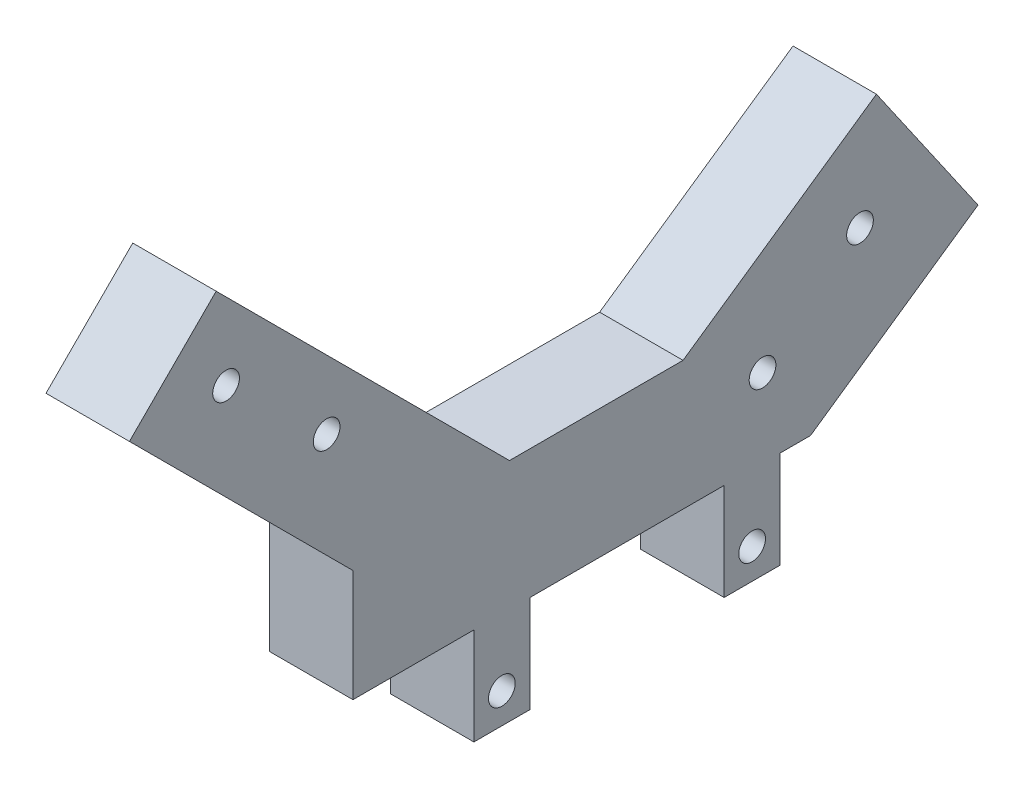
ISO-10303-21;
HEADER;
FILE_DESCRIPTION(('STEP AP214'),'2;1');
FILE_NAME('part.step','',(''),(''),'','','');
FILE_SCHEMA(('AUTOMOTIVE_DESIGN { 1 0 10303 214 1 1 1 1 }'));
ENDSEC;
DATA;
#1=APPLICATION_CONTEXT('core data for automotive mechanical design processes');
#2=APPLICATION_PROTOCOL_DEFINITION('international standard','automotive_design',2000,#1);
#3=PRODUCT_CONTEXT('',#1,'mechanical');
#4=PRODUCT('Part','Part','',(#3));
#5=PRODUCT_RELATED_PRODUCT_CATEGORY('part','',(#4));
#6=PRODUCT_DEFINITION_FORMATION('','',#4);
#7=PRODUCT_DEFINITION_CONTEXT('part definition',#1,'design');
#8=PRODUCT_DEFINITION('design','',#6,#7);
#9=PRODUCT_DEFINITION_SHAPE('','',#8);
#10=(LENGTH_UNIT() NAMED_UNIT(*) SI_UNIT(.MILLI.,.METRE.));
#11=(NAMED_UNIT(*) PLANE_ANGLE_UNIT() SI_UNIT($,.RADIAN.));
#12=(NAMED_UNIT(*) SI_UNIT($,.STERADIAN.) SOLID_ANGLE_UNIT());
#13=UNCERTAINTY_MEASURE_WITH_UNIT(LENGTH_MEASURE(1.E-05),#10,'distance_accuracy_value','');
#14=(GEOMETRIC_REPRESENTATION_CONTEXT(3) GLOBAL_UNCERTAINTY_ASSIGNED_CONTEXT((#13)) GLOBAL_UNIT_ASSIGNED_CONTEXT((#10,
#11,#12)) REPRESENTATION_CONTEXT('',''));
#15=CARTESIAN_POINT('',(0.,0.,0.));
#16=DIRECTION('',(0.,0.,1.));
#17=DIRECTION('',(1.,0.,0.));
#18=AXIS2_PLACEMENT_3D('',#15,#16,#17);
#19=CARTESIAN_POINT('',(10.,0.,0.));
#20=DIRECTION('',(1.,0.,0.));
#21=DIRECTION('',(0.,0.,-1.));
#22=AXIS2_PLACEMENT_3D('',#19,#20,#21);
#23=PLANE('',#22);
#24=CARTESIAN_POINT('',(10.,5.41185763148744,-16.2492077736495));
#25=DIRECTION('',(1.,0.,0.));
#26=DIRECTION('',(0.,0.,-1.));
#27=AXIS2_PLACEMENT_3D('',#24,#25,#26);
#28=CIRCLE('',#27,1.60000000000001);
#29=CARTESIAN_POINT('',(10.,5.41185763148744,-17.8492077736496));
#30=VERTEX_POINT('',#29);
#31=EDGE_CURVE('E366',#30,#30,#28,.T.);
#32=ORIENTED_EDGE('',*,*,#31,.F.);
#33=EDGE_LOOP('',(#32));
#34=FACE_BOUND('',#33,.T.);
#35=CARTESIAN_POINT('',(10.,36.2116014360766,48.0605143808522));
#36=DIRECTION('',(1.,0.,0.));
#37=DIRECTION('',(0.,0.,-1.));
#38=AXIS2_PLACEMENT_3D('',#35,#36,#37);
#39=CIRCLE('',#38,1.60000000000001);
#40=CARTESIAN_POINT('',(10.,36.2116014360766,46.4605143808522));
#41=VERTEX_POINT('',#40);
#42=EDGE_CURVE('E378',#41,#41,#39,.T.);
#43=ORIENTED_EDGE('',*,*,#42,.F.);
#44=EDGE_LOOP('',(#43));
#45=FACE_BOUND('',#44,.T.);
#46=CARTESIAN_POINT('',(10.,-12.,15.));
#47=DIRECTION('',(1.,0.,0.));
#48=DIRECTION('',(0.,0.,-1.));
#49=AXIS2_PLACEMENT_3D('',#46,#47,#48);
#50=CIRCLE('',#49,1.6);
#51=CARTESIAN_POINT('',(10.,-12.,13.4));
#52=VERTEX_POINT('',#51);
#53=EDGE_CURVE('E190',#52,#52,#50,.T.);
#54=ORIENTED_EDGE('',*,*,#53,.F.);
#55=EDGE_LOOP('',(#54));
#56=FACE_BOUND('',#55,.T.);
#57=DIRECTION('',(0.,0.568973278929439,-0.822356010414153));
#58=VECTOR('',#57,1.);
#59=CARTESIAN_POINT('',(10.,9.89128378958278,-42.078824948909));
#60=LINE('',#59,#58);
#61=CARTESIAN_POINT('',(10.,-4.00000000000002,-22.0012903092747));
#62=VERTEX_POINT('',#61);
#63=CARTESIAN_POINT('',(10.,9.89128378958278,-42.078824948909));
#64=VERTEX_POINT('',#63);
#65=EDGE_CURVE('E219',#62,#64,#60,.T.);
#66=ORIENTED_EDGE('',*,*,#65,.T.);
#67=DIRECTION('',(0.,0.822356010414153,0.568973278929439));
#68=VECTOR('',#67,1.);
#69=CARTESIAN_POINT('',(10.,27.4894583263576,-29.9029656585772));
#70=LINE('',#69,#68);
#71=CARTESIAN_POINT('',(10.,27.4894583263576,-29.9029656585772));
#72=VERTEX_POINT('',#71);
#73=EDGE_CURVE('E122',#64,#72,#70,.T.);
#74=ORIENTED_EDGE('',*,*,#73,.T.);
#75=DIRECTION('',(0.,-0.568973278929439,0.822356010414153));
#76=VECTOR('',#75,1.);
#77=CARTESIAN_POINT('',(10.,11.4487113078294,-6.71874029910208));
#78=LINE('',#77,#76);
#79=CARTESIAN_POINT('',(10.,11.4487113078294,-6.71874029910208));
#80=VERTEX_POINT('',#79);
#81=EDGE_CURVE('E261',#72,#80,#78,.T.);
#82=ORIENTED_EDGE('',*,*,#81,.T.);
#83=DIRECTION('',(0.,0.,1.));
#84=VECTOR('',#83,1.);
#85=CARTESIAN_POINT('',(10.,11.4487113078294,-6.71874029910208));
#86=LINE('',#85,#84);
#87=CARTESIAN_POINT('',(10.,11.4487113078294,14.0864897849331));
#88=VERTEX_POINT('',#87);
#89=EDGE_CURVE('E280',#80,#88,#86,.T.);
#90=ORIENTED_EDGE('',*,*,#89,.T.);
#91=DIRECTION('',(0.,0.707106781186548,0.707106781186548));
#92=VECTOR('',#91,1.);
#93=CARTESIAN_POINT('',(10.,11.4487113078294,14.0864897849331));
#94=LINE('',#93,#92);
#95=CARTESIAN_POINT('',(10.,46.6102733867151,49.2480518638188));
#96=VERTEX_POINT('',#95);
#97=EDGE_CURVE('E277',#88,#96,#94,.T.);
#98=ORIENTED_EDGE('',*,*,#97,.T.);
#99=DIRECTION('',(0.,-0.707106781186548,0.707106781186548));
#100=VECTOR('',#99,1.);
#101=CARTESIAN_POINT('',(10.,46.6102733867151,49.2480518638188));
#102=LINE('',#101,#100);
#103=CARTESIAN_POINT('',(10.,36.2116014360766,59.6467238144573));
#104=VERTEX_POINT('',#103);
#105=EDGE_CURVE('E279',#96,#104,#102,.T.);
#106=ORIENTED_EDGE('',*,*,#105,.T.);
#107=DIRECTION('',(0.,-0.707106781186547,-0.707106781186548));
#108=VECTOR('',#107,1.);
#109=CARTESIAN_POINT('',(10.,36.2116014360766,59.6467238144573));
#110=LINE('',#109,#108);
#111=CARTESIAN_POINT('',(10.,9.41325329115229,32.848375669533));
#112=VERTEX_POINT('',#111);
#113=EDGE_CURVE('E282',#104,#112,#110,.T.);
#114=ORIENTED_EDGE('',*,*,#113,.T.);
#115=DIRECTION('',(0.,-1.,0.));
#116=VECTOR('',#115,1.);
#117=CARTESIAN_POINT('',(10.,9.41325329115229,32.848375669533));
#118=LINE('',#117,#116);
#119=CARTESIAN_POINT('',(10.,-3.99999999999999,32.848375669533));
#120=VERTEX_POINT('',#119);
#121=EDGE_CURVE('E288',#112,#120,#118,.T.);
#122=ORIENTED_EDGE('',*,*,#121,.T.);
#123=DIRECTION('',(0.,0.,-1.));
#124=VECTOR('',#123,1.);
#125=CARTESIAN_POINT('',(10.,-3.99999999999999,32.848375669533));
#126=LINE('',#125,#124);
#127=CARTESIAN_POINT('',(10.,-3.99999999999999,18.3510305569159));
#128=VERTEX_POINT('',#127);
#129=EDGE_CURVE('E290',#120,#128,#126,.T.);
#130=ORIENTED_EDGE('',*,*,#129,.T.);
#131=DIRECTION('',(0.,-1.,0.));
#132=VECTOR('',#131,1.);
#133=CARTESIAN_POINT('',(10.,-15.6388685978096,18.3510305569159));
#134=LINE('',#133,#132);
#135=CARTESIAN_POINT('',(10.,-15.6388685978096,18.3510305569159));
#136=VERTEX_POINT('',#135);
#137=EDGE_CURVE('E292',#128,#136,#134,.T.);
#138=ORIENTED_EDGE('',*,*,#137,.T.);
#139=DIRECTION('',(0.,0.,-1.));
#140=VECTOR('',#139,1.);
#141=CARTESIAN_POINT('',(10.,-15.6388685978096,11.6489694430841));
#142=LINE('',#141,#140);
#143=CARTESIAN_POINT('',(10.,-15.6388685978096,11.6489694430841));
#144=VERTEX_POINT('',#143);
#145=EDGE_CURVE('E294',#136,#144,#142,.T.);
#146=ORIENTED_EDGE('',*,*,#145,.T.);
#147=DIRECTION('',(0.,1.,0.));
#148=VECTOR('',#147,1.);
#149=CARTESIAN_POINT('',(10.,-15.6388685978096,11.6489694430841));
#150=LINE('',#149,#148);
#151=CARTESIAN_POINT('',(10.,-3.99999999999999,11.6489694430841));
#152=VERTEX_POINT('',#151);
#153=EDGE_CURVE('E296',#144,#152,#150,.T.);
#154=ORIENTED_EDGE('',*,*,#153,.T.);
#155=DIRECTION('',(0.,0.,-1.));
#156=VECTOR('',#155,1.);
#157=CARTESIAN_POINT('',(10.,-3.99999999999999,11.6489694430841));
#158=LINE('',#157,#156);
#159=CARTESIAN_POINT('',(10.,-4.00000000000001,-11.6489694430841));
#160=VERTEX_POINT('',#159);
#161=EDGE_CURVE('E298',#152,#160,#158,.T.);
#162=ORIENTED_EDGE('',*,*,#161,.T.);
#163=DIRECTION('',(0.,-1.,0.));
#164=VECTOR('',#163,1.);
#165=CARTESIAN_POINT('',(10.,-15.6388685978096,-11.6489694430841));
#166=LINE('',#165,#164);
#167=CARTESIAN_POINT('',(10.,-15.6388685978096,-11.6489694430841));
#168=VERTEX_POINT('',#167);
#169=EDGE_CURVE('E168',#160,#168,#166,.T.);
#170=ORIENTED_EDGE('',*,*,#169,.T.);
#171=DIRECTION('',(0.,0.,-1.));
#172=VECTOR('',#171,1.);
#173=CARTESIAN_POINT('',(10.,-15.6388685978096,-11.6489694430841));
#174=LINE('',#173,#172);
#175=CARTESIAN_POINT('',(10.,-15.6388685978096,-18.351030556916));
#176=VERTEX_POINT('',#175);
#177=EDGE_CURVE('E162',#168,#176,#174,.T.);
#178=ORIENTED_EDGE('',*,*,#177,.T.);
#179=DIRECTION('',(0.,1.,0.));
#180=VECTOR('',#179,1.);
#181=CARTESIAN_POINT('',(10.,-15.6388685978096,-18.351030556916));
#182=LINE('',#181,#180);
#183=CARTESIAN_POINT('',(10.,-4.00000000000002,-18.351030556916));
#184=VERTEX_POINT('',#183);
#185=EDGE_CURVE('E166',#176,#184,#182,.T.);
#186=ORIENTED_EDGE('',*,*,#185,.T.);
#187=DIRECTION('',(0.,0.,-1.));
#188=VECTOR('',#187,1.);
#189=CARTESIAN_POINT('',(10.,-4.00000000000002,-18.351030556916));
#190=LINE('',#189,#188);
#191=EDGE_CURVE('E52',#184,#62,#190,.T.);
#192=ORIENTED_EDGE('',*,*,#191,.T.);
#193=EDGE_LOOP('',(#66,#74,#82,#90,#98,#106,#114,#122,#130,#138,#146,#154,#162,#170,#178,#186,#192));
#194=FACE_BOUND('',#193,.T.);
#195=CARTESIAN_POINT('',(10.,-12.,-15.));
#196=DIRECTION('',(1.,0.,0.));
#197=DIRECTION('',(0.,0.,1.));
#198=AXIS2_PLACEMENT_3D('',#195,#196,#197);
#199=CIRCLE('',#198,1.6);
#200=CARTESIAN_POINT('',(10.,-12.,-13.4));
#201=VERTEX_POINT('',#200);
#202=EDGE_CURVE('E384',#201,#201,#199,.T.);
#203=ORIENTED_EDGE('',*,*,#202,.F.);
#204=EDGE_LOOP('',(#203));
#205=FACE_BOUND('',#204,.T.);
#206=CARTESIAN_POINT('',(10.,25.1432496561641,36.0024414768831));
#207=DIRECTION('',(1.,0.,0.));
#208=DIRECTION('',(0.,0.,-1.));
#209=AXIS2_PLACEMENT_3D('',#206,#207,#208);
#210=CIRCLE('',#209,1.6);
#211=CARTESIAN_POINT('',(10.,25.1432496561641,34.4024414768831));
#212=VERTEX_POINT('',#211);
#213=EDGE_CURVE('E372',#212,#212,#210,.T.);
#214=ORIENTED_EDGE('',*,*,#213,.F.);
#215=EDGE_LOOP('',(#214));
#216=FACE_BOUND('',#215,.T.);
#217=CARTESIAN_POINT('',(10.,14.6001091843119,-27.9316534368526));
#218=DIRECTION('',(1.,0.,0.));
#219=DIRECTION('',(0.,0.,-1.));
#220=AXIS2_PLACEMENT_3D('',#217,#218,#219);
#221=CIRCLE('',#220,1.60000000000001);
#222=CARTESIAN_POINT('',(10.,14.6001091843119,-29.5316534368526));
#223=VERTEX_POINT('',#222);
#224=EDGE_CURVE('E357',#223,#223,#221,.T.);
#225=ORIENTED_EDGE('',*,*,#224,.F.);
#226=EDGE_LOOP('',(#225));
#227=FACE_BOUND('',#226,.T.);
#228=ADVANCED_FACE('F35',(#34,#45,#56,#194,#205,#216,#227),#23,.T.);
#229=CARTESIAN_POINT('',(0.,0.,0.));
#230=DIRECTION('',(1.,0.,0.));
#231=DIRECTION('',(0.,0.,-1.));
#232=AXIS2_PLACEMENT_3D('',#229,#230,#231);
#233=PLANE('',#232);
#234=DIRECTION('',(0.,0.568973278929439,-0.822356010414153));
#235=VECTOR('',#234,1.);
#236=CARTESIAN_POINT('',(0.,9.89128378958278,-42.078824948909));
#237=LINE('',#236,#235);
#238=CARTESIAN_POINT('',(0.,-4.00000000000002,-22.0012903092747));
#239=VERTEX_POINT('',#238);
#240=CARTESIAN_POINT('',(0.,9.89128378958278,-42.078824948909));
#241=VERTEX_POINT('',#240);
#242=EDGE_CURVE('E186',#239,#241,#237,.T.);
#243=ORIENTED_EDGE('',*,*,#242,.F.);
#244=DIRECTION('',(0.,0.,-1.));
#245=VECTOR('',#244,1.);
#246=CARTESIAN_POINT('',(0.,-4.00000000000002,-18.351030556916));
#247=LINE('',#246,#245);
#248=CARTESIAN_POINT('',(0.,-4.00000000000002,-18.351030556916));
#249=VERTEX_POINT('',#248);
#250=EDGE_CURVE('E114',#249,#239,#247,.T.);
#251=ORIENTED_EDGE('',*,*,#250,.F.);
#252=DIRECTION('',(0.,1.,0.));
#253=VECTOR('',#252,1.);
#254=CARTESIAN_POINT('',(0.,-15.6388685978096,-18.351030556916));
#255=LINE('',#254,#253);
#256=CARTESIAN_POINT('',(0.,-15.6388685978096,-18.351030556916));
#257=VERTEX_POINT('',#256);
#258=EDGE_CURVE('E108',#257,#249,#255,.T.);
#259=ORIENTED_EDGE('',*,*,#258,.F.);
#260=DIRECTION('',(0.,0.,-1.));
#261=VECTOR('',#260,1.);
#262=CARTESIAN_POINT('',(0.,-15.6388685978096,-11.6489694430841));
#263=LINE('',#262,#261);
#264=CARTESIAN_POINT('',(0.,-15.6388685978096,-11.6489694430841));
#265=VERTEX_POINT('',#264);
#266=EDGE_CURVE('E176',#265,#257,#263,.T.);
#267=ORIENTED_EDGE('',*,*,#266,.F.);
#268=DIRECTION('',(0.,-1.,0.));
#269=VECTOR('',#268,1.);
#270=CARTESIAN_POINT('',(0.,-15.6388685978096,-11.6489694430841));
#271=LINE('',#270,#269);
#272=CARTESIAN_POINT('',(0.,-4.00000000000001,-11.6489694430841));
#273=VERTEX_POINT('',#272);
#274=EDGE_CURVE('E214',#273,#265,#271,.T.);
#275=ORIENTED_EDGE('',*,*,#274,.F.);
#276=DIRECTION('',(0.,0.,-1.));
#277=VECTOR('',#276,1.);
#278=CARTESIAN_POINT('',(0.,-3.99999999999999,11.6489694430841));
#279=LINE('',#278,#277);
#280=CARTESIAN_POINT('',(0.,-3.99999999999999,11.6489694430841));
#281=VERTEX_POINT('',#280);
#282=EDGE_CURVE('E212',#281,#273,#279,.T.);
#283=ORIENTED_EDGE('',*,*,#282,.F.);
#284=DIRECTION('',(0.,1.,0.));
#285=VECTOR('',#284,1.);
#286=CARTESIAN_POINT('',(0.,-15.6388685978096,11.6489694430841));
#287=LINE('',#286,#285);
#288=CARTESIAN_POINT('',(0.,-15.6388685978096,11.6489694430841));
#289=VERTEX_POINT('',#288);
#290=EDGE_CURVE('E210',#289,#281,#287,.T.);
#291=ORIENTED_EDGE('',*,*,#290,.F.);
#292=DIRECTION('',(0.,0.,-1.));
#293=VECTOR('',#292,1.);
#294=CARTESIAN_POINT('',(0.,-15.6388685978096,11.6489694430841));
#295=LINE('',#294,#293);
#296=CARTESIAN_POINT('',(0.,-15.6388685978096,18.3510305569159));
#297=VERTEX_POINT('',#296);
#298=EDGE_CURVE('E208',#297,#289,#295,.T.);
#299=ORIENTED_EDGE('',*,*,#298,.F.);
#300=DIRECTION('',(0.,-1.,0.));
#301=VECTOR('',#300,1.);
#302=CARTESIAN_POINT('',(0.,-15.6388685978096,18.3510305569159));
#303=LINE('',#302,#301);
#304=CARTESIAN_POINT('',(0.,-3.99999999999999,18.3510305569159));
#305=VERTEX_POINT('',#304);
#306=EDGE_CURVE('E206',#305,#297,#303,.T.);
#307=ORIENTED_EDGE('',*,*,#306,.F.);
#308=DIRECTION('',(0.,0.,-1.));
#309=VECTOR('',#308,1.);
#310=CARTESIAN_POINT('',(0.,-3.99999999999999,32.848375669533));
#311=LINE('',#310,#309);
#312=CARTESIAN_POINT('',(0.,-3.99999999999999,32.848375669533));
#313=VERTEX_POINT('',#312);
#314=EDGE_CURVE('E204',#313,#305,#311,.T.);
#315=ORIENTED_EDGE('',*,*,#314,.F.);
#316=DIRECTION('',(0.,-1.,0.));
#317=VECTOR('',#316,1.);
#318=CARTESIAN_POINT('',(0.,9.41325329115229,32.848375669533));
#319=LINE('',#318,#317);
#320=CARTESIAN_POINT('',(0.,9.41325329115229,32.848375669533));
#321=VERTEX_POINT('',#320);
#322=EDGE_CURVE('E202',#321,#313,#319,.T.);
#323=ORIENTED_EDGE('',*,*,#322,.F.);
#324=DIRECTION('',(0.,-0.707106781186547,-0.707106781186548));
#325=VECTOR('',#324,1.);
#326=CARTESIAN_POINT('',(0.,36.2116014360766,59.6467238144573));
#327=LINE('',#326,#325);
#328=CARTESIAN_POINT('',(0.,36.2116014360766,59.6467238144573));
#329=VERTEX_POINT('',#328);
#330=EDGE_CURVE('E200',#329,#321,#327,.T.);
#331=ORIENTED_EDGE('',*,*,#330,.F.);
#332=DIRECTION('',(0.,-0.707106781186548,0.707106781186548));
#333=VECTOR('',#332,1.);
#334=CARTESIAN_POINT('',(0.,46.6102733867151,49.2480518638188));
#335=LINE('',#334,#333);
#336=CARTESIAN_POINT('',(0.,46.6102733867151,49.2480518638188));
#337=VERTEX_POINT('',#336);
#338=EDGE_CURVE('E198',#337,#329,#335,.T.);
#339=ORIENTED_EDGE('',*,*,#338,.F.);
#340=DIRECTION('',(0.,0.707106781186548,0.707106781186548));
#341=VECTOR('',#340,1.);
#342=CARTESIAN_POINT('',(0.,11.4487113078294,14.0864897849331));
#343=LINE('',#342,#341);
#344=CARTESIAN_POINT('',(0.,11.4487113078294,14.0864897849331));
#345=VERTEX_POINT('',#344);
#346=EDGE_CURVE('E196',#345,#337,#343,.T.);
#347=ORIENTED_EDGE('',*,*,#346,.F.);
#348=DIRECTION('',(0.,0.,1.));
#349=VECTOR('',#348,1.);
#350=CARTESIAN_POINT('',(0.,11.4487113078294,-6.71874029910208));
#351=LINE('',#350,#349);
#352=CARTESIAN_POINT('',(0.,11.4487113078294,-6.71874029910208));
#353=VERTEX_POINT('',#352);
#354=EDGE_CURVE('E194',#353,#345,#351,.T.);
#355=ORIENTED_EDGE('',*,*,#354,.F.);
#356=DIRECTION('',(0.,-0.568973278929439,0.822356010414153));
#357=VECTOR('',#356,1.);
#358=CARTESIAN_POINT('',(0.,11.4487113078294,-6.71874029910208));
#359=LINE('',#358,#357);
#360=CARTESIAN_POINT('',(0.,27.4894583263576,-29.9029656585772));
#361=VERTEX_POINT('',#360);
#362=EDGE_CURVE('E192',#361,#353,#359,.T.);
#363=ORIENTED_EDGE('',*,*,#362,.F.);
#364=DIRECTION('',(0.,0.822356010414153,0.568973278929439));
#365=VECTOR('',#364,1.);
#366=CARTESIAN_POINT('',(0.,27.4894583263576,-29.9029656585772));
#367=LINE('',#366,#365);
#368=EDGE_CURVE('E189',#241,#361,#367,.T.);
#369=ORIENTED_EDGE('',*,*,#368,.F.);
#370=EDGE_LOOP('',(#243,#251,#259,#267,#275,#283,#291,#299,#307,#315,#323,#331,#339,#347,#355,
#363,#369));
#371=FACE_BOUND('',#370,.T.);
#372=CARTESIAN_POINT('',(0.,-12.,15.));
#373=DIRECTION('',(1.,0.,0.));
#374=DIRECTION('',(0.,0.,-1.));
#375=AXIS2_PLACEMENT_3D('',#372,#373,#374);
#376=CIRCLE('',#375,1.6);
#377=CARTESIAN_POINT('',(0.,-12.,13.4));
#378=VERTEX_POINT('',#377);
#379=EDGE_CURVE('E387',#378,#378,#376,.T.);
#380=ORIENTED_EDGE('',*,*,#379,.T.);
#381=EDGE_LOOP('',(#380));
#382=FACE_BOUND('',#381,.T.);
#383=CARTESIAN_POINT('',(0.,-12.,-15.));
#384=DIRECTION('',(1.,0.,0.));
#385=DIRECTION('',(0.,0.,1.));
#386=AXIS2_PLACEMENT_3D('',#383,#384,#385);
#387=CIRCLE('',#386,1.6);
#388=CARTESIAN_POINT('',(0.,-12.,-13.4));
#389=VERTEX_POINT('',#388);
#390=EDGE_CURVE('E381',#389,#389,#387,.T.);
#391=ORIENTED_EDGE('',*,*,#390,.T.);
#392=EDGE_LOOP('',(#391));
#393=FACE_BOUND('',#392,.T.);
#394=CARTESIAN_POINT('',(0.,36.2116014360766,48.0605143808522));
#395=DIRECTION('',(1.,0.,0.));
#396=DIRECTION('',(0.,0.,-1.));
#397=AXIS2_PLACEMENT_3D('',#394,#395,#396);
#398=CIRCLE('',#397,1.60000000000001);
#399=CARTESIAN_POINT('',(0.,36.2116014360766,46.4605143808522));
#400=VERTEX_POINT('',#399);
#401=EDGE_CURVE('E375',#400,#400,#398,.T.);
#402=ORIENTED_EDGE('',*,*,#401,.T.);
#403=EDGE_LOOP('',(#402));
#404=FACE_BOUND('',#403,.T.);
#405=CARTESIAN_POINT('',(0.,25.1432496561641,36.0024414768831));
#406=DIRECTION('',(1.,0.,0.));
#407=DIRECTION('',(0.,0.,-1.));
#408=AXIS2_PLACEMENT_3D('',#405,#406,#407);
#409=CIRCLE('',#408,1.6);
#410=CARTESIAN_POINT('',(0.,25.1432496561641,34.4024414768831));
#411=VERTEX_POINT('',#410);
#412=EDGE_CURVE('E369',#411,#411,#409,.T.);
#413=ORIENTED_EDGE('',*,*,#412,.T.);
#414=EDGE_LOOP('',(#413));
#415=FACE_BOUND('',#414,.T.);
#416=CARTESIAN_POINT('',(0.,5.41185763148744,-16.2492077736495));
#417=DIRECTION('',(1.,0.,0.));
#418=DIRECTION('',(0.,0.,-1.));
#419=AXIS2_PLACEMENT_3D('',#416,#417,#418);
#420=CIRCLE('',#419,1.60000000000001);
#421=CARTESIAN_POINT('',(0.,5.41185763148744,-17.8492077736496));
#422=VERTEX_POINT('',#421);
#423=EDGE_CURVE('E363',#422,#422,#420,.T.);
#424=ORIENTED_EDGE('',*,*,#423,.T.);
#425=EDGE_LOOP('',(#424));
#426=FACE_BOUND('',#425,.T.);
#427=CARTESIAN_POINT('',(0.,14.6001091843119,-27.9316534368526));
#428=DIRECTION('',(1.,0.,0.));
#429=DIRECTION('',(0.,0.,-1.));
#430=AXIS2_PLACEMENT_3D('',#427,#428,#429);
#431=CIRCLE('',#430,1.60000000000001);
#432=CARTESIAN_POINT('',(0.,14.6001091843119,-29.5316534368526));
#433=VERTEX_POINT('',#432);
#434=EDGE_CURVE('E360',#433,#433,#431,.T.);
#435=ORIENTED_EDGE('',*,*,#434,.T.);
#436=EDGE_LOOP('',(#435));
#437=FACE_BOUND('',#436,.T.);
#438=ADVANCED_FACE('F265',(#371,#382,#393,#404,#415,#426,#437),#233,.F.);
#439=CARTESIAN_POINT('',(10.,9.89128378958278,-42.078824948909));
#440=DIRECTION('',(0.,0.822356010414153,0.568973278929439));
#441=DIRECTION('',(0.,-0.568973278929439,0.822356010414153));
#442=AXIS2_PLACEMENT_3D('',#439,#440,#441);
#443=PLANE('',#442);
#444=ORIENTED_EDGE('',*,*,#242,.T.);
#445=DIRECTION('',(-1.,0.,0.));
#446=VECTOR('',#445,1.);
#447=CARTESIAN_POINT('',(10.,9.89128378958278,-42.078824948909));
#448=LINE('',#447,#446);
#449=EDGE_CURVE('E11',#64,#241,#448,.T.);
#450=ORIENTED_EDGE('',*,*,#449,.F.);
#451=ORIENTED_EDGE('',*,*,#65,.F.);
#452=DIRECTION('',(-1.,0.,0.));
#453=VECTOR('',#452,1.);
#454=CARTESIAN_POINT('',(10.,-4.00000000000002,-22.0012903092747));
#455=LINE('',#454,#453);
#456=EDGE_CURVE('E182',#62,#239,#455,.T.);
#457=ORIENTED_EDGE('',*,*,#456,.T.);
#458=EDGE_LOOP('',(#444,#450,#451,#457));
#459=FACE_BOUND('',#458,.T.);
#460=ADVANCED_FACE('F37',(#459),#443,.F.);
#461=CARTESIAN_POINT('',(10.,27.4894583263576,-29.9029656585772));
#462=DIRECTION('',(0.,-0.568973278929439,0.822356010414153));
#463=DIRECTION('',(0.,-0.822356010414153,-0.568973278929439));
#464=AXIS2_PLACEMENT_3D('',#461,#462,#463);
#465=PLANE('',#464);
#466=ORIENTED_EDGE('',*,*,#368,.T.);
#467=DIRECTION('',(-1.,0.,0.));
#468=VECTOR('',#467,1.);
#469=CARTESIAN_POINT('',(10.,27.4894583263576,-29.9029656585772));
#470=LINE('',#469,#468);
#471=EDGE_CURVE('E44',#72,#361,#470,.T.);
#472=ORIENTED_EDGE('',*,*,#471,.F.);
#473=ORIENTED_EDGE('',*,*,#73,.F.);
#474=ORIENTED_EDGE('',*,*,#449,.T.);
#475=EDGE_LOOP('',(#466,#472,#473,#474));
#476=FACE_BOUND('',#475,.T.);
#477=ADVANCED_FACE('F565',(#476),#465,.F.);
#478=CARTESIAN_POINT('',(10.,11.4487113078294,-6.71874029910208));
#479=DIRECTION('',(0.,-0.822356010414153,-0.568973278929439));
#480=DIRECTION('',(0.,0.568973278929439,-0.822356010414153));
#481=AXIS2_PLACEMENT_3D('',#478,#479,#480);
#482=PLANE('',#481);
#483=ORIENTED_EDGE('',*,*,#362,.T.);
#484=DIRECTION('',(-1.,0.,0.));
#485=VECTOR('',#484,1.);
#486=CARTESIAN_POINT('',(10.,11.4487113078294,-6.71874029910208));
#487=LINE('',#486,#485);
#488=EDGE_CURVE('E253',#80,#353,#487,.T.);
#489=ORIENTED_EDGE('',*,*,#488,.F.);
#490=ORIENTED_EDGE('',*,*,#81,.F.);
#491=ORIENTED_EDGE('',*,*,#471,.T.);
#492=EDGE_LOOP('',(#483,#489,#490,#491));
#493=FACE_BOUND('',#492,.T.);
#494=ADVANCED_FACE('F259',(#493),#482,.F.);
#495=CARTESIAN_POINT('',(10.,11.4487113078294,-6.71874029910208));
#496=DIRECTION('',(0.,-1.,0.));
#497=DIRECTION('',(0.,0.,-1.));
#498=AXIS2_PLACEMENT_3D('',#495,#496,#497);
#499=PLANE('',#498);
#500=ORIENTED_EDGE('',*,*,#354,.T.);
#501=DIRECTION('',(-1.,0.,0.));
#502=VECTOR('',#501,1.);
#503=CARTESIAN_POINT('',(10.,11.4487113078294,14.0864897849331));
#504=LINE('',#503,#502);
#505=EDGE_CURVE('E250',#88,#345,#504,.T.);
#506=ORIENTED_EDGE('',*,*,#505,.F.);
#507=ORIENTED_EDGE('',*,*,#89,.F.);
#508=ORIENTED_EDGE('',*,*,#488,.T.);
#509=EDGE_LOOP('',(#500,#506,#507,#508));
#510=FACE_BOUND('',#509,.T.);
#511=ADVANCED_FACE('F271',(#510),#499,.F.);
#512=CARTESIAN_POINT('',(10.,11.4487113078294,14.0864897849331));
#513=DIRECTION('',(0.,-0.707106781186548,0.707106781186548));
#514=DIRECTION('',(0.,-0.707106781186548,-0.707106781186548));
#515=AXIS2_PLACEMENT_3D('',#512,#513,#514);
#516=PLANE('',#515);
#517=ORIENTED_EDGE('',*,*,#346,.T.);
#518=DIRECTION('',(-1.,0.,0.));
#519=VECTOR('',#518,1.);
#520=CARTESIAN_POINT('',(10.,46.6102733867151,49.2480518638188));
#521=LINE('',#520,#519);
#522=EDGE_CURVE('E247',#96,#337,#521,.T.);
#523=ORIENTED_EDGE('',*,*,#522,.F.);
#524=ORIENTED_EDGE('',*,*,#97,.F.);
#525=ORIENTED_EDGE('',*,*,#505,.T.);
#526=EDGE_LOOP('',(#517,#523,#524,#525));
#527=FACE_BOUND('',#526,.T.);
#528=ADVANCED_FACE('F275',(#527),#516,.F.);
#529=CARTESIAN_POINT('',(10.,46.6102733867151,49.2480518638188));
#530=DIRECTION('',(0.,-0.707106781186548,-0.707106781186548));
#531=DIRECTION('',(0.,0.707106781186548,-0.707106781186548));
#532=AXIS2_PLACEMENT_3D('',#529,#530,#531);
#533=PLANE('',#532);
#534=ORIENTED_EDGE('',*,*,#338,.T.);
#535=DIRECTION('',(-1.,0.,0.));
#536=VECTOR('',#535,1.);
#537=CARTESIAN_POINT('',(10.,36.2116014360766,59.6467238144573));
#538=LINE('',#537,#536);
#539=EDGE_CURVE('E244',#104,#329,#538,.T.);
#540=ORIENTED_EDGE('',*,*,#539,.F.);
#541=ORIENTED_EDGE('',*,*,#105,.F.);
#542=ORIENTED_EDGE('',*,*,#522,.T.);
#543=EDGE_LOOP('',(#534,#540,#541,#542));
#544=FACE_BOUND('',#543,.T.);
#545=ADVANCED_FACE('F530',(#544),#533,.F.);
#546=CARTESIAN_POINT('',(10.,36.2116014360766,59.6467238144573));
#547=DIRECTION('',(0.,0.707106781186548,-0.707106781186547));
#548=DIRECTION('',(0.,0.707106781186547,0.707106781186548));
#549=AXIS2_PLACEMENT_3D('',#546,#547,#548);
#550=PLANE('',#549);
#551=ORIENTED_EDGE('',*,*,#330,.T.);
#552=DIRECTION('',(-1.,0.,0.));
#553=VECTOR('',#552,1.);
#554=CARTESIAN_POINT('',(10.,9.41325329115229,32.848375669533));
#555=LINE('',#554,#553);
#556=EDGE_CURVE('E241',#112,#321,#555,.T.);
#557=ORIENTED_EDGE('',*,*,#556,.F.);
#558=ORIENTED_EDGE('',*,*,#113,.F.);
#559=ORIENTED_EDGE('',*,*,#539,.T.);
#560=EDGE_LOOP('',(#551,#557,#558,#559));
#561=FACE_BOUND('',#560,.T.);
#562=ADVANCED_FACE('F520',(#561),#550,.F.);
#563=CARTESIAN_POINT('',(10.,9.41325329115229,32.848375669533));
#564=DIRECTION('',(0.,0.,-1.));
#565=DIRECTION('',(-1.,0.,0.));
#566=AXIS2_PLACEMENT_3D('',#563,#564,#565);
#567=PLANE('',#566);
#568=ORIENTED_EDGE('',*,*,#322,.T.);
#569=DIRECTION('',(-1.,0.,0.));
#570=VECTOR('',#569,1.);
#571=CARTESIAN_POINT('',(10.,-3.99999999999999,32.848375669533));
#572=LINE('',#571,#570);
#573=EDGE_CURVE('E238',#120,#313,#572,.T.);
#574=ORIENTED_EDGE('',*,*,#573,.F.);
#575=ORIENTED_EDGE('',*,*,#121,.F.);
#576=ORIENTED_EDGE('',*,*,#556,.T.);
#577=EDGE_LOOP('',(#568,#574,#575,#576));
#578=FACE_BOUND('',#577,.T.);
#579=ADVANCED_FACE('F510',(#578),#567,.F.);
#580=CARTESIAN_POINT('',(10.,-3.99999999999999,32.848375669533));
#581=DIRECTION('',(0.,1.,0.));
#582=DIRECTION('',(0.,0.,1.));
#583=AXIS2_PLACEMENT_3D('',#580,#581,#582);
#584=PLANE('',#583);
#585=ORIENTED_EDGE('',*,*,#314,.T.);
#586=DIRECTION('',(-1.,0.,0.));
#587=VECTOR('',#586,1.);
#588=CARTESIAN_POINT('',(10.,-3.99999999999999,18.3510305569159));
#589=LINE('',#588,#587);
#590=EDGE_CURVE('E235',#128,#305,#589,.T.);
#591=ORIENTED_EDGE('',*,*,#590,.F.);
#592=ORIENTED_EDGE('',*,*,#129,.F.);
#593=ORIENTED_EDGE('',*,*,#573,.T.);
#594=EDGE_LOOP('',(#585,#591,#592,#593));
#595=FACE_BOUND('',#594,.T.);
#596=ADVANCED_FACE('F500',(#595),#584,.F.);
#597=CARTESIAN_POINT('',(10.,-15.6388685978096,18.3510305569159));
#598=DIRECTION('',(0.,0.,-1.));
#599=DIRECTION('',(-1.,0.,0.));
#600=AXIS2_PLACEMENT_3D('',#597,#598,#599);
#601=PLANE('',#600);
#602=ORIENTED_EDGE('',*,*,#306,.T.);
#603=DIRECTION('',(-1.,0.,0.));
#604=VECTOR('',#603,1.);
#605=CARTESIAN_POINT('',(10.,-15.6388685978096,18.3510305569159));
#606=LINE('',#605,#604);
#607=EDGE_CURVE('E232',#136,#297,#606,.T.);
#608=ORIENTED_EDGE('',*,*,#607,.F.);
#609=ORIENTED_EDGE('',*,*,#137,.F.);
#610=ORIENTED_EDGE('',*,*,#590,.T.);
#611=EDGE_LOOP('',(#602,#608,#609,#610));
#612=FACE_BOUND('',#611,.T.);
#613=ADVANCED_FACE('F490',(#612),#601,.F.);
#614=CARTESIAN_POINT('',(10.,-15.6388685978096,11.6489694430841));
#615=DIRECTION('',(0.,1.,0.));
#616=DIRECTION('',(0.,0.,1.));
#617=AXIS2_PLACEMENT_3D('',#614,#615,#616);
#618=PLANE('',#617);
#619=ORIENTED_EDGE('',*,*,#298,.T.);
#620=DIRECTION('',(-1.,0.,0.));
#621=VECTOR('',#620,1.);
#622=CARTESIAN_POINT('',(10.,-15.6388685978096,11.6489694430841));
#623=LINE('',#622,#621);
#624=EDGE_CURVE('E229',#144,#289,#623,.T.);
#625=ORIENTED_EDGE('',*,*,#624,.F.);
#626=ORIENTED_EDGE('',*,*,#145,.F.);
#627=ORIENTED_EDGE('',*,*,#607,.T.);
#628=EDGE_LOOP('',(#619,#625,#626,#627));
#629=FACE_BOUND('',#628,.T.);
#630=ADVANCED_FACE('F480',(#629),#618,.F.);
#631=CARTESIAN_POINT('',(10.,-15.6388685978096,11.6489694430841));
#632=DIRECTION('',(0.,0.,1.));
#633=DIRECTION('',(1.,0.,0.));
#634=AXIS2_PLACEMENT_3D('',#631,#632,#633);
#635=PLANE('',#634);
#636=ORIENTED_EDGE('',*,*,#290,.T.);
#637=DIRECTION('',(-1.,0.,0.));
#638=VECTOR('',#637,1.);
#639=CARTESIAN_POINT('',(10.,-3.99999999999999,11.6489694430841));
#640=LINE('',#639,#638);
#641=EDGE_CURVE('E226',#152,#281,#640,.T.);
#642=ORIENTED_EDGE('',*,*,#641,.F.);
#643=ORIENTED_EDGE('',*,*,#153,.F.);
#644=ORIENTED_EDGE('',*,*,#624,.T.);
#645=EDGE_LOOP('',(#636,#642,#643,#644));
#646=FACE_BOUND('',#645,.T.);
#647=ADVANCED_FACE('F471',(#646),#635,.F.);
#648=CARTESIAN_POINT('',(10.,-3.99999999999999,11.6489694430841));
#649=DIRECTION('',(0.,1.,0.));
#650=DIRECTION('',(0.,0.,1.));
#651=AXIS2_PLACEMENT_3D('',#648,#649,#650);
#652=PLANE('',#651);
#653=ORIENTED_EDGE('',*,*,#282,.T.);
#654=DIRECTION('',(-1.,0.,0.));
#655=VECTOR('',#654,1.);
#656=CARTESIAN_POINT('',(10.,-4.00000000000001,-11.6489694430841));
#657=LINE('',#656,#655);
#658=EDGE_CURVE('E223',#160,#273,#657,.T.);
#659=ORIENTED_EDGE('',*,*,#658,.F.);
#660=ORIENTED_EDGE('',*,*,#161,.F.);
#661=ORIENTED_EDGE('',*,*,#641,.T.);
#662=EDGE_LOOP('',(#653,#659,#660,#661));
#663=FACE_BOUND('',#662,.T.);
#664=ADVANCED_FACE('F304',(#663),#652,.F.);
#665=CARTESIAN_POINT('',(10.,-15.6388685978096,-11.6489694430841));
#666=DIRECTION('',(0.,0.,-1.));
#667=DIRECTION('',(0.,1.,0.));
#668=AXIS2_PLACEMENT_3D('',#665,#666,#667);
#669=PLANE('',#668);
#670=ORIENTED_EDGE('',*,*,#274,.T.);
#671=DIRECTION('',(-1.,0.,0.));
#672=VECTOR('',#671,1.);
#673=CARTESIAN_POINT('',(10.,-15.6388685978096,-11.6489694430841));
#674=LINE('',#673,#672);
#675=EDGE_CURVE('E177',#168,#265,#674,.T.);
#676=ORIENTED_EDGE('',*,*,#675,.F.);
#677=ORIENTED_EDGE('',*,*,#169,.F.);
#678=ORIENTED_EDGE('',*,*,#658,.T.);
#679=EDGE_LOOP('',(#670,#676,#677,#678));
#680=FACE_BOUND('',#679,.T.);
#681=ADVANCED_FACE('F308',(#680),#669,.F.);
#682=CARTESIAN_POINT('',(10.,-15.6388685978096,-11.6489694430841));
#683=DIRECTION('',(0.,1.,0.));
#684=DIRECTION('',(0.,0.,1.));
#685=AXIS2_PLACEMENT_3D('',#682,#683,#684);
#686=PLANE('',#685);
#687=ORIENTED_EDGE('',*,*,#266,.T.);
#688=DIRECTION('',(-1.,0.,0.));
#689=VECTOR('',#688,1.);
#690=CARTESIAN_POINT('',(10.,-15.6388685978096,-18.351030556916));
#691=LINE('',#690,#689);
#692=EDGE_CURVE('E173',#176,#257,#691,.T.);
#693=ORIENTED_EDGE('',*,*,#692,.F.);
#694=ORIENTED_EDGE('',*,*,#177,.F.);
#695=ORIENTED_EDGE('',*,*,#675,.T.);
#696=EDGE_LOOP('',(#687,#693,#694,#695));
#697=FACE_BOUND('',#696,.T.);
#698=ADVANCED_FACE('F174',(#697),#686,.F.);
#699=CARTESIAN_POINT('',(10.,-15.6388685978096,-18.351030556916));
#700=DIRECTION('',(0.,0.,1.));
#701=DIRECTION('',(0.,-1.,0.));
#702=AXIS2_PLACEMENT_3D('',#699,#700,#701);
#703=PLANE('',#702);
#704=ORIENTED_EDGE('',*,*,#258,.T.);
#705=DIRECTION('',(-1.,0.,0.));
#706=VECTOR('',#705,1.);
#707=CARTESIAN_POINT('',(10.,-4.00000000000002,-18.351030556916));
#708=LINE('',#707,#706);
#709=EDGE_CURVE('E178',#184,#249,#708,.T.);
#710=ORIENTED_EDGE('',*,*,#709,.F.);
#711=ORIENTED_EDGE('',*,*,#185,.F.);
#712=ORIENTED_EDGE('',*,*,#692,.T.);
#713=EDGE_LOOP('',(#704,#710,#711,#712));
#714=FACE_BOUND('',#713,.T.);
#715=ADVANCED_FACE('F180',(#714),#703,.F.);
#716=CARTESIAN_POINT('',(10.,-4.00000000000002,-18.351030556916));
#717=DIRECTION('',(0.,1.,0.));
#718=DIRECTION('',(0.,0.,1.));
#719=AXIS2_PLACEMENT_3D('',#716,#717,#718);
#720=PLANE('',#719);
#721=ORIENTED_EDGE('',*,*,#250,.T.);
#722=ORIENTED_EDGE('',*,*,#456,.F.);
#723=ORIENTED_EDGE('',*,*,#191,.F.);
#724=ORIENTED_EDGE('',*,*,#709,.T.);
#725=EDGE_LOOP('',(#721,#722,#723,#724));
#726=FACE_BOUND('',#725,.T.);
#727=ADVANCED_FACE('F312',(#726),#720,.F.);
#728=CARTESIAN_POINT('',(10.,-12.,15.));
#729=DIRECTION('',(-1.,0.,0.));
#730=DIRECTION('',(0.,0.,1.));
#731=AXIS2_PLACEMENT_3D('',#728,#729,#730);
#732=CYLINDRICAL_SURFACE('',#731,1.6);
#733=ORIENTED_EDGE('',*,*,#53,.T.);
#734=EDGE_LOOP('',(#733));
#735=FACE_BOUND('',#734,.T.);
#736=ORIENTED_EDGE('',*,*,#379,.F.);
#737=EDGE_LOOP('',(#736));
#738=FACE_BOUND('',#737,.T.);
#739=ADVANCED_FACE('F314',(#735,#738),#732,.F.);
#740=CARTESIAN_POINT('',(10.,-12.,-15.));
#741=DIRECTION('',(-1.,0.,0.));
#742=DIRECTION('',(0.,0.,1.));
#743=AXIS2_PLACEMENT_3D('',#740,#741,#742);
#744=CYLINDRICAL_SURFACE('',#743,1.6);
#745=ORIENTED_EDGE('',*,*,#202,.T.);
#746=EDGE_LOOP('',(#745));
#747=FACE_BOUND('',#746,.T.);
#748=ORIENTED_EDGE('',*,*,#390,.F.);
#749=EDGE_LOOP('',(#748));
#750=FACE_BOUND('',#749,.T.);
#751=ADVANCED_FACE('F320',(#747,#750),#744,.F.);
#752=CARTESIAN_POINT('',(10.,36.2116014360766,48.0605143808522));
#753=DIRECTION('',(-1.,0.,0.));
#754=DIRECTION('',(0.,0.,1.));
#755=AXIS2_PLACEMENT_3D('',#752,#753,#754);
#756=CYLINDRICAL_SURFACE('',#755,1.60000000000001);
#757=ORIENTED_EDGE('',*,*,#42,.T.);
#758=EDGE_LOOP('',(#757));
#759=FACE_BOUND('',#758,.T.);
#760=ORIENTED_EDGE('',*,*,#401,.F.);
#761=EDGE_LOOP('',(#760));
#762=FACE_BOUND('',#761,.T.);
#763=ADVANCED_FACE('F336',(#759,#762),#756,.F.);
#764=CARTESIAN_POINT('',(10.,25.1432496561641,36.0024414768831));
#765=DIRECTION('',(-1.,0.,0.));
#766=DIRECTION('',(0.,0.,1.));
#767=AXIS2_PLACEMENT_3D('',#764,#765,#766);
#768=CYLINDRICAL_SURFACE('',#767,1.6);
#769=ORIENTED_EDGE('',*,*,#213,.T.);
#770=EDGE_LOOP('',(#769));
#771=FACE_BOUND('',#770,.T.);
#772=ORIENTED_EDGE('',*,*,#412,.F.);
#773=EDGE_LOOP('',(#772));
#774=FACE_BOUND('',#773,.T.);
#775=ADVANCED_FACE('F340',(#771,#774),#768,.F.);
#776=CARTESIAN_POINT('',(10.,5.41185763148744,-16.2492077736495));
#777=DIRECTION('',(-1.,0.,0.));
#778=DIRECTION('',(0.,0.,1.));
#779=AXIS2_PLACEMENT_3D('',#776,#777,#778);
#780=CYLINDRICAL_SURFACE('',#779,1.60000000000001);
#781=ORIENTED_EDGE('',*,*,#31,.T.);
#782=EDGE_LOOP('',(#781));
#783=FACE_BOUND('',#782,.T.);
#784=ORIENTED_EDGE('',*,*,#423,.F.);
#785=EDGE_LOOP('',(#784));
#786=FACE_BOUND('',#785,.T.);
#787=ADVANCED_FACE('F344',(#783,#786),#780,.F.);
#788=CARTESIAN_POINT('',(10.,14.6001091843119,-27.9316534368526));
#789=DIRECTION('',(-1.,0.,0.));
#790=DIRECTION('',(0.,0.,1.));
#791=AXIS2_PLACEMENT_3D('',#788,#789,#790);
#792=CYLINDRICAL_SURFACE('',#791,1.60000000000001);
#793=ORIENTED_EDGE('',*,*,#224,.T.);
#794=EDGE_LOOP('',(#793));
#795=FACE_BOUND('',#794,.T.);
#796=ORIENTED_EDGE('',*,*,#434,.F.);
#797=EDGE_LOOP('',(#796));
#798=FACE_BOUND('',#797,.T.);
#799=ADVANCED_FACE('F348',(#795,#798),#792,.F.);
#800=CLOSED_SHELL('',(#228,#438,#460,#477,#494,#511,#528,#545,#562,#579,#596,#613,#630,#647,
#664,#681,#698,#715,#727,#739,#751,#763,#775,#787,#799));
#801=MANIFOLD_SOLID_BREP('B2',#800);
#802=ADVANCED_BREP_SHAPE_REPRESENTATION('',(#18,#801),#14);
#803=SHAPE_DEFINITION_REPRESENTATION(#9,#802);
ENDSEC;
END-ISO-10303-21;
